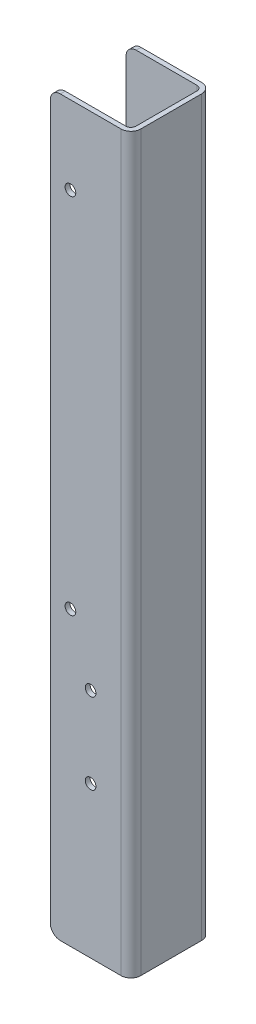
ISO-10303-21;
HEADER;
FILE_DESCRIPTION(('STEP AP214'),'2;1');
FILE_NAME('part.step','',(''),(''),'','','');
FILE_SCHEMA(('AUTOMOTIVE_DESIGN { 1 0 10303 214 1 1 1 1 }'));
ENDSEC;
DATA;
#1=APPLICATION_CONTEXT('core data for automotive mechanical design processes');
#2=APPLICATION_PROTOCOL_DEFINITION('international standard','automotive_design',2000,#1);
#3=PRODUCT_CONTEXT('',#1,'mechanical');
#4=PRODUCT('Part','Part','',(#3));
#5=PRODUCT_RELATED_PRODUCT_CATEGORY('part','',(#4));
#6=PRODUCT_DEFINITION_FORMATION('','',#4);
#7=PRODUCT_DEFINITION_CONTEXT('part definition',#1,'design');
#8=PRODUCT_DEFINITION('design','',#6,#7);
#9=PRODUCT_DEFINITION_SHAPE('','',#8);
#10=(LENGTH_UNIT() NAMED_UNIT(*) SI_UNIT(.MILLI.,.METRE.));
#11=(NAMED_UNIT(*) PLANE_ANGLE_UNIT() SI_UNIT($,.RADIAN.));
#12=(NAMED_UNIT(*) SI_UNIT($,.STERADIAN.) SOLID_ANGLE_UNIT());
#13=UNCERTAINTY_MEASURE_WITH_UNIT(LENGTH_MEASURE(1.E-05),#10,'distance_accuracy_value','');
#14=(GEOMETRIC_REPRESENTATION_CONTEXT(3) GLOBAL_UNCERTAINTY_ASSIGNED_CONTEXT((#13)) GLOBAL_UNIT_ASSIGNED_CONTEXT((#10,
#11,#12)) REPRESENTATION_CONTEXT('',''));
#15=CARTESIAN_POINT('',(0.,0.,0.));
#16=DIRECTION('',(0.,0.,1.));
#17=DIRECTION('',(1.,0.,0.));
#18=AXIS2_PLACEMENT_3D('',#15,#16,#17);
#19=CARTESIAN_POINT('',(-50.8,0.,22.36216));
#20=DIRECTION('',(-1.,0.,0.));
#21=DIRECTION('',(0.,0.,1.));
#22=AXIS2_PLACEMENT_3D('',#19,#20,#21);
#23=PLANE('',#22);
#24=DIRECTION('',(0.,0.,-1.));
#25=VECTOR('',#24,1.);
#26=CARTESIAN_POINT('',(-50.8,6.35,91.62288));
#27=LINE('',#26,#25);
#28=CARTESIAN_POINT('',(-50.8,6.35,25.4));
#29=VERTEX_POINT('',#28);
#30=CARTESIAN_POINT('',(-50.8,6.35,22.36216));
#31=VERTEX_POINT('',#30);
#32=EDGE_CURVE('E108',#29,#31,#27,.T.);
#33=ORIENTED_EDGE('',*,*,#32,.F.);
#34=DIRECTION('',(0.,1.,0.));
#35=VECTOR('',#34,1.);
#36=CARTESIAN_POINT('',(-50.8,0.,25.4));
#37=LINE('',#36,#35);
#38=CARTESIAN_POINT('',(-50.8,455.6125,25.4));
#39=VERTEX_POINT('',#38);
#40=EDGE_CURVE('E222',#39,#29,#37,.F.);
#41=ORIENTED_EDGE('',*,*,#40,.F.);
#42=DIRECTION('',(0.,0.,1.));
#43=VECTOR('',#42,1.);
#44=CARTESIAN_POINT('',(-50.8,455.6125,-91.62288));
#45=LINE('',#44,#43);
#46=CARTESIAN_POINT('',(-50.8,455.6125,22.36216));
#47=VERTEX_POINT('',#46);
#48=EDGE_CURVE('E142',#47,#39,#45,.T.);
#49=ORIENTED_EDGE('',*,*,#48,.F.);
#50=DIRECTION('',(0.,1.,0.));
#51=VECTOR('',#50,1.);
#52=CARTESIAN_POINT('',(-50.8,0.,22.36216));
#53=LINE('',#52,#51);
#54=EDGE_CURVE('E111',#31,#47,#53,.T.);
#55=ORIENTED_EDGE('',*,*,#54,.F.);
#56=EDGE_LOOP('',(#33,#41,#49,#55));
#57=FACE_BOUND('',#56,.T.);
#58=ADVANCED_FACE('F16',(#57),#23,.T.);
#59=CARTESIAN_POINT('',(-25.4,95.25,25.4));
#60=DIRECTION('',(0.,0.,1.));
#61=DIRECTION('',(1.,0.,0.));
#62=AXIS2_PLACEMENT_3D('',#59,#60,#61);
#63=CYLINDRICAL_SURFACE('',#62,3.3655);
#64=CARTESIAN_POINT('',(-25.4,95.25,25.4));
#65=DIRECTION('',(0.,0.,1.));
#66=DIRECTION('',(1.,0.,0.));
#67=AXIS2_PLACEMENT_3D('',#64,#65,#66);
#68=CIRCLE('',#67,3.3655);
#69=CARTESIAN_POINT('',(-22.0345,95.25,25.4));
#70=VERTEX_POINT('',#69);
#71=EDGE_CURVE('E217',#70,#70,#68,.F.);
#72=ORIENTED_EDGE('',*,*,#71,.F.);
#73=EDGE_LOOP('',(#72));
#74=FACE_BOUND('',#73,.T.);
#75=CARTESIAN_POINT('',(-25.4,95.25,22.36216));
#76=DIRECTION('',(0.,0.,1.));
#77=DIRECTION('',(1.,0.,0.));
#78=AXIS2_PLACEMENT_3D('',#75,#76,#77);
#79=CIRCLE('',#78,3.3655);
#80=CARTESIAN_POINT('',(-22.0345,95.25,22.36216));
#81=VERTEX_POINT('',#80);
#82=EDGE_CURVE('E235',#81,#81,#79,.T.);
#83=ORIENTED_EDGE('',*,*,#82,.F.);
#84=EDGE_LOOP('',(#83));
#85=FACE_BOUND('',#84,.T.);
#86=ADVANCED_FACE('F435',(#74,#85),#63,.F.);
#87=CARTESIAN_POINT('',(-25.4,146.05,25.4));
#88=DIRECTION('',(0.,0.,1.));
#89=DIRECTION('',(1.,0.,0.));
#90=AXIS2_PLACEMENT_3D('',#87,#88,#89);
#91=CYLINDRICAL_SURFACE('',#90,3.3655);
#92=CARTESIAN_POINT('',(-25.4,146.05,25.4));
#93=DIRECTION('',(0.,0.,1.));
#94=DIRECTION('',(1.,0.,0.));
#95=AXIS2_PLACEMENT_3D('',#92,#93,#94);
#96=CIRCLE('',#95,3.3655);
#97=CARTESIAN_POINT('',(-22.0345,146.05,25.4));
#98=VERTEX_POINT('',#97);
#99=EDGE_CURVE('E214',#98,#98,#96,.F.);
#100=ORIENTED_EDGE('',*,*,#99,.F.);
#101=EDGE_LOOP('',(#100));
#102=FACE_BOUND('',#101,.T.);
#103=CARTESIAN_POINT('',(-25.4,146.05,22.36216));
#104=DIRECTION('',(0.,0.,1.));
#105=DIRECTION('',(1.,0.,0.));
#106=AXIS2_PLACEMENT_3D('',#103,#104,#105);
#107=CIRCLE('',#106,3.3655);
#108=CARTESIAN_POINT('',(-22.0345,146.05,22.36216));
#109=VERTEX_POINT('',#108);
#110=EDGE_CURVE('E233',#109,#109,#107,.T.);
#111=ORIENTED_EDGE('',*,*,#110,.F.);
#112=EDGE_LOOP('',(#111));
#113=FACE_BOUND('',#112,.T.);
#114=ADVANCED_FACE('F432',(#102,#113),#91,.F.);
#115=CARTESIAN_POINT('',(-38.1,184.15,25.4));
#116=DIRECTION('',(0.,0.,1.));
#117=DIRECTION('',(1.,0.,0.));
#118=AXIS2_PLACEMENT_3D('',#115,#116,#117);
#119=CYLINDRICAL_SURFACE('',#118,3.3655);
#120=CARTESIAN_POINT('',(-38.1,184.15,25.4));
#121=DIRECTION('',(0.,0.,1.));
#122=DIRECTION('',(1.,0.,0.));
#123=AXIS2_PLACEMENT_3D('',#120,#121,#122);
#124=CIRCLE('',#123,3.3655);
#125=CARTESIAN_POINT('',(-34.7345,184.15,25.4));
#126=VERTEX_POINT('',#125);
#127=EDGE_CURVE('E211',#126,#126,#124,.F.);
#128=ORIENTED_EDGE('',*,*,#127,.F.);
#129=EDGE_LOOP('',(#128));
#130=FACE_BOUND('',#129,.T.);
#131=CARTESIAN_POINT('',(-38.1,184.15,22.36216));
#132=DIRECTION('',(0.,0.,1.));
#133=DIRECTION('',(1.,0.,0.));
#134=AXIS2_PLACEMENT_3D('',#131,#132,#133);
#135=CIRCLE('',#134,3.3655);
#136=CARTESIAN_POINT('',(-34.7345,184.15,22.36216));
#137=VERTEX_POINT('',#136);
#138=EDGE_CURVE('E230',#137,#137,#135,.T.);
#139=ORIENTED_EDGE('',*,*,#138,.F.);
#140=EDGE_LOOP('',(#139));
#141=FACE_BOUND('',#140,.T.);
#142=ADVANCED_FACE('F428',(#130,#141),#119,.F.);
#143=CARTESIAN_POINT('',(-38.1,412.75,25.4));
#144=DIRECTION('',(0.,0.,1.));
#145=DIRECTION('',(1.,0.,0.));
#146=AXIS2_PLACEMENT_3D('',#143,#144,#145);
#147=CYLINDRICAL_SURFACE('',#146,3.3655);
#148=CARTESIAN_POINT('',(-38.1,412.75,25.4));
#149=DIRECTION('',(0.,0.,1.));
#150=DIRECTION('',(1.,0.,0.));
#151=AXIS2_PLACEMENT_3D('',#148,#149,#150);
#152=CIRCLE('',#151,3.3655);
#153=CARTESIAN_POINT('',(-34.7345,412.75,25.4));
#154=VERTEX_POINT('',#153);
#155=EDGE_CURVE('E207',#154,#154,#152,.F.);
#156=ORIENTED_EDGE('',*,*,#155,.F.);
#157=EDGE_LOOP('',(#156));
#158=FACE_BOUND('',#157,.T.);
#159=CARTESIAN_POINT('',(-38.1,412.75,22.36216));
#160=DIRECTION('',(0.,0.,1.));
#161=DIRECTION('',(1.,0.,0.));
#162=AXIS2_PLACEMENT_3D('',#159,#160,#161);
#163=CIRCLE('',#162,3.3655);
#164=CARTESIAN_POINT('',(-34.7345,412.75,22.36216));
#165=VERTEX_POINT('',#164);
#166=EDGE_CURVE('E227',#165,#165,#163,.T.);
#167=ORIENTED_EDGE('',*,*,#166,.F.);
#168=EDGE_LOOP('',(#167));
#169=FACE_BOUND('',#168,.T.);
#170=ADVANCED_FACE('F425',(#158,#169),#147,.F.);
#171=CARTESIAN_POINT('',(-44.45,6.35,91.62288));
#172=DIRECTION('',(0.,0.,-1.));
#173=DIRECTION('',(-1.,0.,0.));
#174=AXIS2_PLACEMENT_3D('',#171,#172,#173);
#175=CYLINDRICAL_SURFACE('',#174,6.35);
#176=CARTESIAN_POINT('',(-44.45,6.35,25.4));
#177=DIRECTION('',(0.,0.,-1.));
#178=DIRECTION('',(-1.,0.,0.));
#179=AXIS2_PLACEMENT_3D('',#176,#177,#178);
#180=CIRCLE('',#179,6.35);
#181=CARTESIAN_POINT('',(-44.45,0.,25.4));
#182=VERTEX_POINT('',#181);
#183=EDGE_CURVE('E220',#29,#182,#180,.F.);
#184=ORIENTED_EDGE('',*,*,#183,.F.);
#185=ORIENTED_EDGE('',*,*,#32,.T.);
#186=CARTESIAN_POINT('',(-44.45,6.35,22.36216));
#187=DIRECTION('',(0.,0.,-1.));
#188=DIRECTION('',(-1.,0.,0.));
#189=AXIS2_PLACEMENT_3D('',#186,#187,#188);
#190=CIRCLE('',#189,6.35);
#191=CARTESIAN_POINT('',(-44.45,0.,22.36216));
#192=VERTEX_POINT('',#191);
#193=EDGE_CURVE('E19',#192,#31,#190,.T.);
#194=ORIENTED_EDGE('',*,*,#193,.F.);
#195=DIRECTION('',(0.,0.,1.));
#196=VECTOR('',#195,1.);
#197=CARTESIAN_POINT('',(-44.45,0.,0.));
#198=LINE('',#197,#196);
#199=EDGE_CURVE('E106',#192,#182,#198,.T.);
#200=ORIENTED_EDGE('',*,*,#199,.T.);
#201=EDGE_LOOP('',(#184,#185,#194,#200));
#202=FACE_BOUND('',#201,.T.);
#203=ADVANCED_FACE('F104',(#202),#175,.T.);
#204=CARTESIAN_POINT('',(-3.03784,0.,-22.36216));
#205=DIRECTION('',(-1.,0.,0.));
#206=DIRECTION('',(0.,0.,1.));
#207=AXIS2_PLACEMENT_3D('',#204,#205,#206);
#208=PLANE('',#207);
#209=DIRECTION('',(0.,1.,0.));
#210=VECTOR('',#209,1.);
#211=CARTESIAN_POINT('',(-3.03784,-602.214315,19.18716));
#212=LINE('',#211,#210);
#213=CARTESIAN_POINT('',(-3.03784,0.,19.18716));
#214=VERTEX_POINT('',#213);
#215=CARTESIAN_POINT('',(-3.03784,461.9625,19.18716));
#216=VERTEX_POINT('',#215);
#217=EDGE_CURVE('E141',#214,#216,#212,.T.);
#218=ORIENTED_EDGE('',*,*,#217,.T.);
#219=DIRECTION('',(0.,0.,1.));
#220=VECTOR('',#219,1.);
#221=CARTESIAN_POINT('',(-3.03784,461.9625,0.));
#222=LINE('',#221,#220);
#223=CARTESIAN_POINT('',(-3.03784,461.9625,-19.18716));
#224=VERTEX_POINT('',#223);
#225=EDGE_CURVE('E188',#224,#216,#222,.T.);
#226=ORIENTED_EDGE('',*,*,#225,.F.);
#227=DIRECTION('',(0.,1.,0.));
#228=VECTOR('',#227,1.);
#229=CARTESIAN_POINT('',(-3.03784,-602.214315,-19.18716));
#230=LINE('',#229,#228);
#231=CARTESIAN_POINT('',(-3.03784,0.,-19.18716));
#232=VERTEX_POINT('',#231);
#233=EDGE_CURVE('E133',#224,#232,#230,.F.);
#234=ORIENTED_EDGE('',*,*,#233,.T.);
#235=DIRECTION('',(0.,0.,1.));
#236=VECTOR('',#235,1.);
#237=CARTESIAN_POINT('',(-3.03784,0.,0.));
#238=LINE('',#237,#236);
#239=EDGE_CURVE('E200',#232,#214,#238,.T.);
#240=ORIENTED_EDGE('',*,*,#239,.T.);
#241=EDGE_LOOP('',(#218,#226,#234,#240));
#242=FACE_BOUND('',#241,.T.);
#243=ADVANCED_FACE('F250',(#242),#208,.T.);
#244=CARTESIAN_POINT('',(-6.21284,-602.214315,19.18716));
#245=DIRECTION('',(0.,1.,0.));
#246=DIRECTION('',(0.,0.,1.));
#247=AXIS2_PLACEMENT_3D('',#244,#245,#246);
#248=CYLINDRICAL_SURFACE('',#247,3.175);
#249=CARTESIAN_POINT('',(-6.21284,461.9625,19.18716));
#250=DIRECTION('',(0.,1.,0.));
#251=DIRECTION('',(0.,0.,1.));
#252=AXIS2_PLACEMENT_3D('',#249,#250,#251);
#253=CIRCLE('',#252,3.175);
#254=CARTESIAN_POINT('',(-6.21284,461.9625,22.36216));
#255=VERTEX_POINT('',#254);
#256=EDGE_CURVE('E184',#216,#255,#253,.F.);
#257=ORIENTED_EDGE('',*,*,#256,.F.);
#258=ORIENTED_EDGE('',*,*,#217,.F.);
#259=CARTESIAN_POINT('',(-6.21284,0.,19.18716));
#260=DIRECTION('',(0.,1.,0.));
#261=DIRECTION('',(0.,0.,1.));
#262=AXIS2_PLACEMENT_3D('',#259,#260,#261);
#263=CIRCLE('',#262,3.175);
#264=CARTESIAN_POINT('',(-6.21284,0.,22.36216));
#265=VERTEX_POINT('',#264);
#266=EDGE_CURVE('E121',#214,#265,#263,.F.);
#267=ORIENTED_EDGE('',*,*,#266,.T.);
#268=DIRECTION('',(0.,1.,0.));
#269=VECTOR('',#268,1.);
#270=CARTESIAN_POINT('',(-6.21284,0.,22.36216));
#271=LINE('',#270,#269);
#272=EDGE_CURVE('E112',#255,#265,#271,.F.);
#273=ORIENTED_EDGE('',*,*,#272,.F.);
#274=EDGE_LOOP('',(#257,#258,#267,#273));
#275=FACE_BOUND('',#274,.T.);
#276=ADVANCED_FACE('F254',(#275),#248,.F.);
#277=CARTESIAN_POINT('',(-3.03784,0.,22.36216));
#278=DIRECTION('',(0.,0.,-1.));
#279=DIRECTION('',(-1.,0.,0.));
#280=AXIS2_PLACEMENT_3D('',#277,#278,#279);
#281=PLANE('',#280);
#282=ORIENTED_EDGE('',*,*,#166,.T.);
#283=EDGE_LOOP('',(#282));
#284=FACE_BOUND('',#283,.T.);
#285=ORIENTED_EDGE('',*,*,#138,.T.);
#286=EDGE_LOOP('',(#285));
#287=FACE_BOUND('',#286,.T.);
#288=ORIENTED_EDGE('',*,*,#110,.T.);
#289=EDGE_LOOP('',(#288));
#290=FACE_BOUND('',#289,.T.);
#291=ORIENTED_EDGE('',*,*,#82,.T.);
#292=EDGE_LOOP('',(#291));
#293=FACE_BOUND('',#292,.T.);
#294=ORIENTED_EDGE('',*,*,#193,.T.);
#295=ORIENTED_EDGE('',*,*,#54,.T.);
#296=CARTESIAN_POINT('',(-44.45,455.6125,22.36216));
#297=DIRECTION('',(0.,0.,1.));
#298=DIRECTION('',(1.,0.,0.));
#299=AXIS2_PLACEMENT_3D('',#296,#297,#298);
#300=CIRCLE('',#299,6.35);
#301=CARTESIAN_POINT('',(-44.45,461.9625,22.36216));
#302=VERTEX_POINT('',#301);
#303=EDGE_CURVE('E144',#302,#47,#300,.T.);
#304=ORIENTED_EDGE('',*,*,#303,.F.);
#305=DIRECTION('',(1.,0.,0.));
#306=VECTOR('',#305,1.);
#307=CARTESIAN_POINT('',(0.,461.9625,22.36216));
#308=LINE('',#307,#306);
#309=EDGE_CURVE('E187',#255,#302,#308,.F.);
#310=ORIENTED_EDGE('',*,*,#309,.F.);
#311=ORIENTED_EDGE('',*,*,#272,.T.);
#312=DIRECTION('',(1.,0.,0.));
#313=VECTOR('',#312,1.);
#314=CARTESIAN_POINT('',(0.,0.,22.36216));
#315=LINE('',#314,#313);
#316=EDGE_CURVE('E115',#265,#192,#315,.F.);
#317=ORIENTED_EDGE('',*,*,#316,.T.);
#318=EDGE_LOOP('',(#294,#295,#304,#310,#311,#317));
#319=FACE_BOUND('',#318,.T.);
#320=ADVANCED_FACE('F116',(#284,#287,#290,#293,#319),#281,.T.);
#321=CARTESIAN_POINT('',(-44.45,455.6125,-91.62288));
#322=DIRECTION('',(0.,0.,1.));
#323=DIRECTION('',(1.,0.,0.));
#324=AXIS2_PLACEMENT_3D('',#321,#322,#323);
#325=CYLINDRICAL_SURFACE('',#324,6.35);
#326=ORIENTED_EDGE('',*,*,#303,.T.);
#327=ORIENTED_EDGE('',*,*,#48,.T.);
#328=CARTESIAN_POINT('',(-44.45,455.6125,25.4));
#329=DIRECTION('',(0.,0.,1.));
#330=DIRECTION('',(1.,0.,0.));
#331=AXIS2_PLACEMENT_3D('',#328,#329,#330);
#332=CIRCLE('',#331,6.35);
#333=CARTESIAN_POINT('',(-44.45,461.9625,25.4));
#334=VERTEX_POINT('',#333);
#335=EDGE_CURVE('E143',#334,#39,#332,.T.);
#336=ORIENTED_EDGE('',*,*,#335,.F.);
#337=DIRECTION('',(0.,0.,1.));
#338=VECTOR('',#337,1.);
#339=CARTESIAN_POINT('',(-44.45,461.9625,0.));
#340=LINE('',#339,#338);
#341=EDGE_CURVE('E243',#302,#334,#340,.T.);
#342=ORIENTED_EDGE('',*,*,#341,.F.);
#343=EDGE_LOOP('',(#326,#327,#336,#342));
#344=FACE_BOUND('',#343,.T.);
#345=ADVANCED_FACE('F294',(#344),#325,.T.);
#346=CARTESIAN_POINT('',(-50.8,0.,25.4));
#347=DIRECTION('',(0.,0.,1.));
#348=DIRECTION('',(1.,0.,0.));
#349=AXIS2_PLACEMENT_3D('',#346,#347,#348);
#350=PLANE('',#349);
#351=ORIENTED_EDGE('',*,*,#155,.T.);
#352=EDGE_LOOP('',(#351));
#353=FACE_BOUND('',#352,.T.);
#354=ORIENTED_EDGE('',*,*,#127,.T.);
#355=EDGE_LOOP('',(#354));
#356=FACE_BOUND('',#355,.T.);
#357=ORIENTED_EDGE('',*,*,#99,.T.);
#358=EDGE_LOOP('',(#357));
#359=FACE_BOUND('',#358,.T.);
#360=ORIENTED_EDGE('',*,*,#71,.T.);
#361=EDGE_LOOP('',(#360));
#362=FACE_BOUND('',#361,.T.);
#363=DIRECTION('',(0.,-1.,0.));
#364=VECTOR('',#363,1.);
#365=CARTESIAN_POINT('',(-6.223,1064.176815,25.4));
#366=LINE('',#365,#364);
#367=CARTESIAN_POINT('',(-6.223,461.9625,25.4));
#368=VERTEX_POINT('',#367);
#369=CARTESIAN_POINT('',(-6.223,0.,25.4));
#370=VERTEX_POINT('',#369);
#371=EDGE_CURVE('E210',#368,#370,#366,.T.);
#372=ORIENTED_EDGE('',*,*,#371,.F.);
#373=DIRECTION('',(1.,0.,0.));
#374=VECTOR('',#373,1.);
#375=CARTESIAN_POINT('',(0.,461.9625,25.4));
#376=LINE('',#375,#374);
#377=EDGE_CURVE('E183',#334,#368,#376,.T.);
#378=ORIENTED_EDGE('',*,*,#377,.F.);
#379=ORIENTED_EDGE('',*,*,#335,.T.);
#380=ORIENTED_EDGE('',*,*,#40,.T.);
#381=ORIENTED_EDGE('',*,*,#183,.T.);
#382=DIRECTION('',(1.,0.,0.));
#383=VECTOR('',#382,1.);
#384=CARTESIAN_POINT('',(0.,0.,25.4));
#385=LINE('',#384,#383);
#386=EDGE_CURVE('E127',#182,#370,#385,.T.);
#387=ORIENTED_EDGE('',*,*,#386,.T.);
#388=EDGE_LOOP('',(#372,#378,#379,#380,#381,#387));
#389=FACE_BOUND('',#388,.T.);
#390=ADVANCED_FACE('F289',(#353,#356,#359,#362,#389),#350,.T.);
#391=CARTESIAN_POINT('',(-6.223,1064.176815,19.177));
#392=DIRECTION('',(0.,-1.,0.));
#393=DIRECTION('',(0.,0.,-1.));
#394=AXIS2_PLACEMENT_3D('',#391,#392,#393);
#395=CYLINDRICAL_SURFACE('',#394,6.223);
#396=CARTESIAN_POINT('',(-6.223,461.9625,19.177));
#397=DIRECTION('',(0.,-1.,0.));
#398=DIRECTION('',(0.,0.,-1.));
#399=AXIS2_PLACEMENT_3D('',#396,#397,#398);
#400=CIRCLE('',#399,6.223);
#401=CARTESIAN_POINT('',(0.,461.9625,19.177));
#402=VERTEX_POINT('',#401);
#403=EDGE_CURVE('E180',#368,#402,#400,.F.);
#404=ORIENTED_EDGE('',*,*,#403,.F.);
#405=ORIENTED_EDGE('',*,*,#371,.T.);
#406=CARTESIAN_POINT('',(-6.223,0.,19.177));
#407=DIRECTION('',(0.,-1.,0.));
#408=DIRECTION('',(0.,0.,-1.));
#409=AXIS2_PLACEMENT_3D('',#406,#407,#408);
#410=CIRCLE('',#409,6.223);
#411=CARTESIAN_POINT('',(0.,0.,19.177));
#412=VERTEX_POINT('',#411);
#413=EDGE_CURVE('E129',#370,#412,#410,.F.);
#414=ORIENTED_EDGE('',*,*,#413,.T.);
#415=DIRECTION('',(0.,1.,0.));
#416=VECTOR('',#415,1.);
#417=CARTESIAN_POINT('',(0.,0.,19.177));
#418=LINE('',#417,#416);
#419=EDGE_CURVE('E281',#402,#412,#418,.F.);
#420=ORIENTED_EDGE('',*,*,#419,.F.);
#421=EDGE_LOOP('',(#404,#405,#414,#420));
#422=FACE_BOUND('',#421,.T.);
#423=ADVANCED_FACE('F341',(#422),#395,.T.);
#424=CARTESIAN_POINT('',(0.,0.,25.4));
#425=DIRECTION('',(1.,0.,0.));
#426=DIRECTION('',(0.,0.,-1.));
#427=AXIS2_PLACEMENT_3D('',#424,#425,#426);
#428=PLANE('',#427);
#429=ORIENTED_EDGE('',*,*,#419,.T.);
#430=DIRECTION('',(0.,0.,1.));
#431=VECTOR('',#430,1.);
#432=CARTESIAN_POINT('',(0.,0.,0.));
#433=LINE('',#432,#431);
#434=CARTESIAN_POINT('',(0.,0.,-19.177));
#435=VERTEX_POINT('',#434);
#436=EDGE_CURVE('E197',#412,#435,#433,.F.);
#437=ORIENTED_EDGE('',*,*,#436,.T.);
#438=DIRECTION('',(0.,-1.,0.));
#439=VECTOR('',#438,1.);
#440=CARTESIAN_POINT('',(0.,1064.176815,-19.177));
#441=LINE('',#440,#439);
#442=CARTESIAN_POINT('',(0.,461.9625,-19.177));
#443=VERTEX_POINT('',#442);
#444=EDGE_CURVE('E278',#443,#435,#441,.T.);
#445=ORIENTED_EDGE('',*,*,#444,.F.);
#446=DIRECTION('',(0.,0.,1.));
#447=VECTOR('',#446,1.);
#448=CARTESIAN_POINT('',(0.,461.9625,0.));
#449=LINE('',#448,#447);
#450=EDGE_CURVE('E179',#402,#443,#449,.F.);
#451=ORIENTED_EDGE('',*,*,#450,.F.);
#452=EDGE_LOOP('',(#429,#437,#445,#451));
#453=FACE_BOUND('',#452,.T.);
#454=ADVANCED_FACE('F344',(#453),#428,.T.);
#455=CARTESIAN_POINT('',(-6.223,1064.176815,-19.177));
#456=DIRECTION('',(0.,-1.,0.));
#457=DIRECTION('',(0.,0.,-1.));
#458=AXIS2_PLACEMENT_3D('',#455,#456,#457);
#459=CYLINDRICAL_SURFACE('',#458,6.223);
#460=CARTESIAN_POINT('',(-6.223,461.9625,-19.177));
#461=DIRECTION('',(0.,-1.,0.));
#462=DIRECTION('',(0.,0.,-1.));
#463=AXIS2_PLACEMENT_3D('',#460,#461,#462);
#464=CIRCLE('',#463,6.223);
#465=CARTESIAN_POINT('',(-6.223,461.9625,-25.4));
#466=VERTEX_POINT('',#465);
#467=EDGE_CURVE('E176',#443,#466,#464,.F.);
#468=ORIENTED_EDGE('',*,*,#467,.F.);
#469=ORIENTED_EDGE('',*,*,#444,.T.);
#470=CARTESIAN_POINT('',(-6.223,0.,-19.177));
#471=DIRECTION('',(0.,-1.,0.));
#472=DIRECTION('',(0.,0.,-1.));
#473=AXIS2_PLACEMENT_3D('',#470,#471,#472);
#474=CIRCLE('',#473,6.223);
#475=CARTESIAN_POINT('',(-6.223,0.,-25.4));
#476=VERTEX_POINT('',#475);
#477=EDGE_CURVE('E194',#435,#476,#474,.F.);
#478=ORIENTED_EDGE('',*,*,#477,.T.);
#479=DIRECTION('',(0.,1.,0.));
#480=VECTOR('',#479,1.);
#481=CARTESIAN_POINT('',(-6.223,0.,-25.4));
#482=LINE('',#481,#480);
#483=EDGE_CURVE('E206',#466,#476,#482,.F.);
#484=ORIENTED_EDGE('',*,*,#483,.F.);
#485=EDGE_LOOP('',(#468,#469,#478,#484));
#486=FACE_BOUND('',#485,.T.);
#487=ADVANCED_FACE('F347',(#486),#459,.T.);
#488=CARTESIAN_POINT('',(0.,0.,-25.4));
#489=DIRECTION('',(0.,0.,-1.));
#490=DIRECTION('',(-1.,0.,0.));
#491=AXIS2_PLACEMENT_3D('',#488,#489,#490);
#492=PLANE('',#491);
#493=CARTESIAN_POINT('',(-38.1,412.75,-25.4));
#494=DIRECTION('',(0.,0.,1.));
#495=DIRECTION('',(1.,0.,0.));
#496=AXIS2_PLACEMENT_3D('',#493,#494,#495);
#497=CIRCLE('',#496,3.3655);
#498=CARTESIAN_POINT('',(-34.7345,412.75,-25.4));
#499=VERTEX_POINT('',#498);
#500=EDGE_CURVE('E163',#499,#499,#497,.T.);
#501=ORIENTED_EDGE('',*,*,#500,.T.);
#502=EDGE_LOOP('',(#501));
#503=FACE_BOUND('',#502,.T.);
#504=CARTESIAN_POINT('',(-38.1,184.15,-25.4));
#505=DIRECTION('',(0.,0.,1.));
#506=DIRECTION('',(1.,0.,0.));
#507=AXIS2_PLACEMENT_3D('',#504,#505,#506);
#508=CIRCLE('',#507,3.3655);
#509=CARTESIAN_POINT('',(-34.7345,184.15,-25.4));
#510=VERTEX_POINT('',#509);
#511=EDGE_CURVE('E166',#510,#510,#508,.T.);
#512=ORIENTED_EDGE('',*,*,#511,.T.);
#513=EDGE_LOOP('',(#512));
#514=FACE_BOUND('',#513,.T.);
#515=CARTESIAN_POINT('',(-25.4,146.05,-25.4));
#516=DIRECTION('',(0.,0.,1.));
#517=DIRECTION('',(1.,0.,0.));
#518=AXIS2_PLACEMENT_3D('',#515,#516,#517);
#519=CIRCLE('',#518,3.3655);
#520=CARTESIAN_POINT('',(-22.0345,146.05,-25.4));
#521=VERTEX_POINT('',#520);
#522=EDGE_CURVE('E169',#521,#521,#519,.T.);
#523=ORIENTED_EDGE('',*,*,#522,.T.);
#524=EDGE_LOOP('',(#523));
#525=FACE_BOUND('',#524,.T.);
#526=CARTESIAN_POINT('',(-25.4,95.25,-25.4));
#527=DIRECTION('',(0.,0.,1.));
#528=DIRECTION('',(1.,0.,0.));
#529=AXIS2_PLACEMENT_3D('',#526,#527,#528);
#530=CIRCLE('',#529,3.3655);
#531=CARTESIAN_POINT('',(-22.0345,95.25,-25.4));
#532=VERTEX_POINT('',#531);
#533=EDGE_CURVE('E172',#532,#532,#530,.T.);
#534=ORIENTED_EDGE('',*,*,#533,.T.);
#535=EDGE_LOOP('',(#534));
#536=FACE_BOUND('',#535,.T.);
#537=CARTESIAN_POINT('',(-44.45,6.35,-25.4));
#538=DIRECTION('',(0.,0.,-1.));
#539=DIRECTION('',(-1.,0.,0.));
#540=AXIS2_PLACEMENT_3D('',#537,#538,#539);
#541=CIRCLE('',#540,6.35);
#542=CARTESIAN_POINT('',(-50.8,6.35,-25.4));
#543=VERTEX_POINT('',#542);
#544=CARTESIAN_POINT('',(-44.45,0.,-25.4));
#545=VERTEX_POINT('',#544);
#546=EDGE_CURVE('E138',#543,#545,#541,.F.);
#547=ORIENTED_EDGE('',*,*,#546,.F.);
#548=DIRECTION('',(0.,1.,0.));
#549=VECTOR('',#548,1.);
#550=CARTESIAN_POINT('',(-50.8,0.,-25.4));
#551=LINE('',#550,#549);
#552=CARTESIAN_POINT('',(-50.8,455.6125,-25.4));
#553=VERTEX_POINT('',#552);
#554=EDGE_CURVE('E135',#553,#543,#551,.F.);
#555=ORIENTED_EDGE('',*,*,#554,.F.);
#556=CARTESIAN_POINT('',(-44.45,455.6125,-25.4));
#557=DIRECTION('',(0.,0.,1.));
#558=DIRECTION('',(1.,0.,0.));
#559=AXIS2_PLACEMENT_3D('',#556,#557,#558);
#560=CIRCLE('',#559,6.35);
#561=CARTESIAN_POINT('',(-44.45,461.9625,-25.4));
#562=VERTEX_POINT('',#561);
#563=EDGE_CURVE('E204',#562,#553,#560,.T.);
#564=ORIENTED_EDGE('',*,*,#563,.F.);
#565=DIRECTION('',(1.,0.,0.));
#566=VECTOR('',#565,1.);
#567=CARTESIAN_POINT('',(0.,461.9625,-25.4));
#568=LINE('',#567,#566);
#569=EDGE_CURVE('E175',#466,#562,#568,.F.);
#570=ORIENTED_EDGE('',*,*,#569,.F.);
#571=ORIENTED_EDGE('',*,*,#483,.T.);
#572=DIRECTION('',(1.,0.,0.));
#573=VECTOR('',#572,1.);
#574=CARTESIAN_POINT('',(0.,0.,-25.4));
#575=LINE('',#574,#573);
#576=EDGE_CURVE('E196',#476,#545,#575,.F.);
#577=ORIENTED_EDGE('',*,*,#576,.T.);
#578=EDGE_LOOP('',(#547,#555,#564,#570,#571,#577));
#579=FACE_BOUND('',#578,.T.);
#580=ADVANCED_FACE('F350',(#503,#514,#525,#536,#579),#492,.T.);
#581=CARTESIAN_POINT('',(-44.45,455.6125,-91.62288));
#582=DIRECTION('',(0.,0.,1.));
#583=DIRECTION('',(1.,0.,0.));
#584=AXIS2_PLACEMENT_3D('',#581,#582,#583);
#585=CYLINDRICAL_SURFACE('',#584,6.35);
#586=ORIENTED_EDGE('',*,*,#563,.T.);
#587=DIRECTION('',(0.,0.,1.));
#588=VECTOR('',#587,1.);
#589=CARTESIAN_POINT('',(-50.8,455.6125,-25.4));
#590=LINE('',#589,#588);
#591=CARTESIAN_POINT('',(-50.8,455.6125,-22.36216));
#592=VERTEX_POINT('',#591);
#593=EDGE_CURVE('E139',#592,#553,#590,.F.);
#594=ORIENTED_EDGE('',*,*,#593,.F.);
#595=CARTESIAN_POINT('',(-44.45,455.6125,-22.36216));
#596=DIRECTION('',(0.,0.,1.));
#597=DIRECTION('',(1.,0.,0.));
#598=AXIS2_PLACEMENT_3D('',#595,#596,#597);
#599=CIRCLE('',#598,6.35);
#600=CARTESIAN_POINT('',(-44.45,461.9625,-22.36216));
#601=VERTEX_POINT('',#600);
#602=EDGE_CURVE('E160',#601,#592,#599,.T.);
#603=ORIENTED_EDGE('',*,*,#602,.F.);
#604=DIRECTION('',(0.,0.,1.));
#605=VECTOR('',#604,1.);
#606=CARTESIAN_POINT('',(-44.45,461.9625,0.));
#607=LINE('',#606,#605);
#608=EDGE_CURVE('E190',#562,#601,#607,.T.);
#609=ORIENTED_EDGE('',*,*,#608,.F.);
#610=EDGE_LOOP('',(#586,#594,#603,#609));
#611=FACE_BOUND('',#610,.T.);
#612=ADVANCED_FACE('F317',(#611),#585,.T.);
#613=CARTESIAN_POINT('',(-50.8,0.,-25.4));
#614=DIRECTION('',(-1.,0.,0.));
#615=DIRECTION('',(0.,0.,1.));
#616=AXIS2_PLACEMENT_3D('',#613,#614,#615);
#617=PLANE('',#616);
#618=DIRECTION('',(0.,0.,-1.));
#619=VECTOR('',#618,1.);
#620=CARTESIAN_POINT('',(-50.8,6.35,91.62288));
#621=LINE('',#620,#619);
#622=CARTESIAN_POINT('',(-50.8,6.35,-22.36216));
#623=VERTEX_POINT('',#622);
#624=EDGE_CURVE('E203',#623,#543,#621,.T.);
#625=ORIENTED_EDGE('',*,*,#624,.F.);
#626=DIRECTION('',(0.,1.,0.));
#627=VECTOR('',#626,1.);
#628=CARTESIAN_POINT('',(-50.8,0.,-22.36216));
#629=LINE('',#628,#627);
#630=EDGE_CURVE('E159',#592,#623,#629,.F.);
#631=ORIENTED_EDGE('',*,*,#630,.F.);
#632=ORIENTED_EDGE('',*,*,#593,.T.);
#633=ORIENTED_EDGE('',*,*,#554,.T.);
#634=EDGE_LOOP('',(#625,#631,#632,#633));
#635=FACE_BOUND('',#634,.T.);
#636=ADVANCED_FACE('F325',(#635),#617,.T.);
#637=CARTESIAN_POINT('',(-44.45,6.35,91.62288));
#638=DIRECTION('',(0.,0.,-1.));
#639=DIRECTION('',(-1.,0.,0.));
#640=AXIS2_PLACEMENT_3D('',#637,#638,#639);
#641=CYLINDRICAL_SURFACE('',#640,6.35);
#642=CARTESIAN_POINT('',(-44.45,6.35,-22.36216));
#643=DIRECTION('',(0.,0.,-1.));
#644=DIRECTION('',(-1.,0.,0.));
#645=AXIS2_PLACEMENT_3D('',#642,#643,#644);
#646=CIRCLE('',#645,6.35);
#647=CARTESIAN_POINT('',(-44.45,0.,-22.36216));
#648=VERTEX_POINT('',#647);
#649=EDGE_CURVE('E155',#623,#648,#646,.F.);
#650=ORIENTED_EDGE('',*,*,#649,.F.);
#651=ORIENTED_EDGE('',*,*,#624,.T.);
#652=ORIENTED_EDGE('',*,*,#546,.T.);
#653=DIRECTION('',(0.,0.,1.));
#654=VECTOR('',#653,1.);
#655=CARTESIAN_POINT('',(-44.45,0.,0.));
#656=LINE('',#655,#654);
#657=EDGE_CURVE('E193',#545,#648,#656,.T.);
#658=ORIENTED_EDGE('',*,*,#657,.T.);
#659=EDGE_LOOP('',(#650,#651,#652,#658));
#660=FACE_BOUND('',#659,.T.);
#661=ADVANCED_FACE('F352',(#660),#641,.T.);
#662=CARTESIAN_POINT('',(0.,0.,0.));
#663=DIRECTION('',(0.,1.,0.));
#664=DIRECTION('',(0.,0.,1.));
#665=AXIS2_PLACEMENT_3D('',#662,#663,#664);
#666=PLANE('',#665);
#667=ORIENTED_EDGE('',*,*,#576,.F.);
#668=ORIENTED_EDGE('',*,*,#477,.F.);
#669=ORIENTED_EDGE('',*,*,#436,.F.);
#670=ORIENTED_EDGE('',*,*,#413,.F.);
#671=ORIENTED_EDGE('',*,*,#386,.F.);
#672=ORIENTED_EDGE('',*,*,#199,.F.);
#673=ORIENTED_EDGE('',*,*,#316,.F.);
#674=ORIENTED_EDGE('',*,*,#266,.F.);
#675=ORIENTED_EDGE('',*,*,#239,.F.);
#676=CARTESIAN_POINT('',(-6.21284,0.,-19.18716));
#677=DIRECTION('',(0.,1.,0.));
#678=DIRECTION('',(0.,0.,1.));
#679=AXIS2_PLACEMENT_3D('',#676,#677,#678);
#680=CIRCLE('',#679,3.175);
#681=CARTESIAN_POINT('',(-6.21284,0.,-22.36216));
#682=VERTEX_POINT('',#681);
#683=EDGE_CURVE('E191',#232,#682,#680,.T.);
#684=ORIENTED_EDGE('',*,*,#683,.T.);
#685=DIRECTION('',(1.,0.,0.));
#686=VECTOR('',#685,1.);
#687=CARTESIAN_POINT('',(-50.8,0.,-22.36216));
#688=LINE('',#687,#686);
#689=EDGE_CURVE('E158',#648,#682,#688,.T.);
#690=ORIENTED_EDGE('',*,*,#689,.F.);
#691=ORIENTED_EDGE('',*,*,#657,.F.);
#692=EDGE_LOOP('',(#667,#668,#669,#670,#671,#672,#673,#674,#675,#684,#690,#691));
#693=FACE_BOUND('',#692,.T.);
#694=ADVANCED_FACE('F125',(#693),#666,.F.);
#695=CARTESIAN_POINT('',(-6.21284,-602.214315,-19.18716));
#696=DIRECTION('',(0.,1.,0.));
#697=DIRECTION('',(0.,0.,1.));
#698=AXIS2_PLACEMENT_3D('',#695,#696,#697);
#699=CYLINDRICAL_SURFACE('',#698,3.175);
#700=CARTESIAN_POINT('',(-6.21284,461.9625,-19.18716));
#701=DIRECTION('',(0.,1.,0.));
#702=DIRECTION('',(0.,0.,1.));
#703=AXIS2_PLACEMENT_3D('',#700,#701,#702);
#704=CIRCLE('',#703,3.175);
#705=CARTESIAN_POINT('',(-6.21284,461.9625,-22.36216));
#706=VERTEX_POINT('',#705);
#707=EDGE_CURVE('E34',#706,#224,#704,.F.);
#708=ORIENTED_EDGE('',*,*,#707,.F.);
#709=DIRECTION('',(0.,1.,0.));
#710=VECTOR('',#709,1.);
#711=CARTESIAN_POINT('',(-6.21284,0.,-22.36216));
#712=LINE('',#711,#710);
#713=EDGE_CURVE('E262',#682,#706,#712,.T.);
#714=ORIENTED_EDGE('',*,*,#713,.F.);
#715=ORIENTED_EDGE('',*,*,#683,.F.);
#716=ORIENTED_EDGE('',*,*,#233,.F.);
#717=EDGE_LOOP('',(#708,#714,#715,#716));
#718=FACE_BOUND('',#717,.T.);
#719=ADVANCED_FACE('F356',(#718),#699,.F.);
#720=CARTESIAN_POINT('',(0.,461.9625,0.));
#721=DIRECTION('',(0.,1.,0.));
#722=DIRECTION('',(0.,0.,1.));
#723=AXIS2_PLACEMENT_3D('',#720,#721,#722);
#724=PLANE('',#723);
#725=ORIENTED_EDGE('',*,*,#467,.T.);
#726=ORIENTED_EDGE('',*,*,#569,.T.);
#727=ORIENTED_EDGE('',*,*,#608,.T.);
#728=DIRECTION('',(1.,0.,0.));
#729=VECTOR('',#728,1.);
#730=CARTESIAN_POINT('',(-50.8,461.9625,-22.36216));
#731=LINE('',#730,#729);
#732=EDGE_CURVE('E154',#706,#601,#731,.F.);
#733=ORIENTED_EDGE('',*,*,#732,.F.);
#734=ORIENTED_EDGE('',*,*,#707,.T.);
#735=ORIENTED_EDGE('',*,*,#225,.T.);
#736=ORIENTED_EDGE('',*,*,#256,.T.);
#737=ORIENTED_EDGE('',*,*,#309,.T.);
#738=ORIENTED_EDGE('',*,*,#341,.T.);
#739=ORIENTED_EDGE('',*,*,#377,.T.);
#740=ORIENTED_EDGE('',*,*,#403,.T.);
#741=ORIENTED_EDGE('',*,*,#450,.T.);
#742=EDGE_LOOP('',(#725,#726,#727,#733,#734,#735,#736,#737,#738,#739,#740,#741));
#743=FACE_BOUND('',#742,.T.);
#744=ADVANCED_FACE('F257',(#743),#724,.T.);
#745=CARTESIAN_POINT('',(-25.4,95.25,25.4));
#746=DIRECTION('',(0.,0.,1.));
#747=DIRECTION('',(1.,0.,0.));
#748=AXIS2_PLACEMENT_3D('',#745,#746,#747);
#749=CYLINDRICAL_SURFACE('',#748,3.3655);
#750=ORIENTED_EDGE('',*,*,#533,.F.);
#751=EDGE_LOOP('',(#750));
#752=FACE_BOUND('',#751,.T.);
#753=CARTESIAN_POINT('',(-25.4,95.25,-22.36216));
#754=DIRECTION('',(0.,0.,1.));
#755=DIRECTION('',(1.,0.,0.));
#756=AXIS2_PLACEMENT_3D('',#753,#754,#755);
#757=CIRCLE('',#756,3.3655);
#758=CARTESIAN_POINT('',(-22.0345,95.25,-22.36216));
#759=VERTEX_POINT('',#758);
#760=EDGE_CURVE('E151',#759,#759,#757,.F.);
#761=ORIENTED_EDGE('',*,*,#760,.F.);
#762=EDGE_LOOP('',(#761));
#763=FACE_BOUND('',#762,.T.);
#764=ADVANCED_FACE('F364',(#752,#763),#749,.F.);
#765=CARTESIAN_POINT('',(-25.4,146.05,25.4));
#766=DIRECTION('',(0.,0.,1.));
#767=DIRECTION('',(1.,0.,0.));
#768=AXIS2_PLACEMENT_3D('',#765,#766,#767);
#769=CYLINDRICAL_SURFACE('',#768,3.3655);
#770=ORIENTED_EDGE('',*,*,#522,.F.);
#771=EDGE_LOOP('',(#770));
#772=FACE_BOUND('',#771,.T.);
#773=CARTESIAN_POINT('',(-25.4,146.05,-22.36216));
#774=DIRECTION('',(0.,0.,1.));
#775=DIRECTION('',(1.,0.,0.));
#776=AXIS2_PLACEMENT_3D('',#773,#774,#775);
#777=CIRCLE('',#776,3.3655);
#778=CARTESIAN_POINT('',(-22.0345,146.05,-22.36216));
#779=VERTEX_POINT('',#778);
#780=EDGE_CURVE('E148',#779,#779,#777,.F.);
#781=ORIENTED_EDGE('',*,*,#780,.F.);
#782=EDGE_LOOP('',(#781));
#783=FACE_BOUND('',#782,.T.);
#784=ADVANCED_FACE('F381',(#772,#783),#769,.F.);
#785=CARTESIAN_POINT('',(-38.1,184.15,25.4));
#786=DIRECTION('',(0.,0.,1.));
#787=DIRECTION('',(1.,0.,0.));
#788=AXIS2_PLACEMENT_3D('',#785,#786,#787);
#789=CYLINDRICAL_SURFACE('',#788,3.3655);
#790=ORIENTED_EDGE('',*,*,#511,.F.);
#791=EDGE_LOOP('',(#790));
#792=FACE_BOUND('',#791,.T.);
#793=CARTESIAN_POINT('',(-38.1,184.15,-22.36216));
#794=DIRECTION('',(0.,0.,1.));
#795=DIRECTION('',(1.,0.,0.));
#796=AXIS2_PLACEMENT_3D('',#793,#794,#795);
#797=CIRCLE('',#796,3.3655);
#798=CARTESIAN_POINT('',(-34.7345,184.15,-22.36216));
#799=VERTEX_POINT('',#798);
#800=EDGE_CURVE('E25',#799,#799,#797,.F.);
#801=ORIENTED_EDGE('',*,*,#800,.F.);
#802=EDGE_LOOP('',(#801));
#803=FACE_BOUND('',#802,.T.);
#804=ADVANCED_FACE('F374',(#792,#803),#789,.F.);
#805=CARTESIAN_POINT('',(-38.1,412.75,25.4));
#806=DIRECTION('',(0.,0.,1.));
#807=DIRECTION('',(1.,0.,0.));
#808=AXIS2_PLACEMENT_3D('',#805,#806,#807);
#809=CYLINDRICAL_SURFACE('',#808,3.3655);
#810=ORIENTED_EDGE('',*,*,#500,.F.);
#811=EDGE_LOOP('',(#810));
#812=FACE_BOUND('',#811,.T.);
#813=CARTESIAN_POINT('',(-38.1,412.75,-22.36216));
#814=DIRECTION('',(0.,0.,1.));
#815=DIRECTION('',(1.,0.,0.));
#816=AXIS2_PLACEMENT_3D('',#813,#814,#815);
#817=CIRCLE('',#816,3.3655);
#818=CARTESIAN_POINT('',(-34.7345,412.75,-22.36216));
#819=VERTEX_POINT('',#818);
#820=EDGE_CURVE('E11',#819,#819,#817,.F.);
#821=ORIENTED_EDGE('',*,*,#820,.F.);
#822=EDGE_LOOP('',(#821));
#823=FACE_BOUND('',#822,.T.);
#824=ADVANCED_FACE('F368',(#812,#823),#809,.F.);
#825=CARTESIAN_POINT('',(-50.8,0.,-22.36216));
#826=DIRECTION('',(0.,0.,1.));
#827=DIRECTION('',(1.,0.,0.));
#828=AXIS2_PLACEMENT_3D('',#825,#826,#827);
#829=PLANE('',#828);
#830=ORIENTED_EDGE('',*,*,#820,.T.);
#831=EDGE_LOOP('',(#830));
#832=FACE_BOUND('',#831,.T.);
#833=ORIENTED_EDGE('',*,*,#800,.T.);
#834=EDGE_LOOP('',(#833));
#835=FACE_BOUND('',#834,.T.);
#836=ORIENTED_EDGE('',*,*,#780,.T.);
#837=EDGE_LOOP('',(#836));
#838=FACE_BOUND('',#837,.T.);
#839=ORIENTED_EDGE('',*,*,#760,.T.);
#840=EDGE_LOOP('',(#839));
#841=FACE_BOUND('',#840,.T.);
#842=ORIENTED_EDGE('',*,*,#713,.T.);
#843=ORIENTED_EDGE('',*,*,#732,.T.);
#844=ORIENTED_EDGE('',*,*,#602,.T.);
#845=ORIENTED_EDGE('',*,*,#630,.T.);
#846=ORIENTED_EDGE('',*,*,#649,.T.);
#847=ORIENTED_EDGE('',*,*,#689,.T.);
#848=EDGE_LOOP('',(#842,#843,#844,#845,#846,#847));
#849=FACE_BOUND('',#848,.T.);
#850=ADVANCED_FACE('F309',(#832,#835,#838,#841,#849),#829,.T.);
#851=CLOSED_SHELL('',(#58,#86,#114,#142,#170,#203,#243,#276,#320,#345,#390,#423,#454,#487,#580,
#612,#636,#661,#694,#719,#744,#764,#784,#804,#824,#850));
#852=MANIFOLD_SOLID_BREP('B1',#851);
#853=ADVANCED_BREP_SHAPE_REPRESENTATION('',(#18,#852),#14);
#854=SHAPE_DEFINITION_REPRESENTATION(#9,#853);
ENDSEC;
END-ISO-10303-21;
